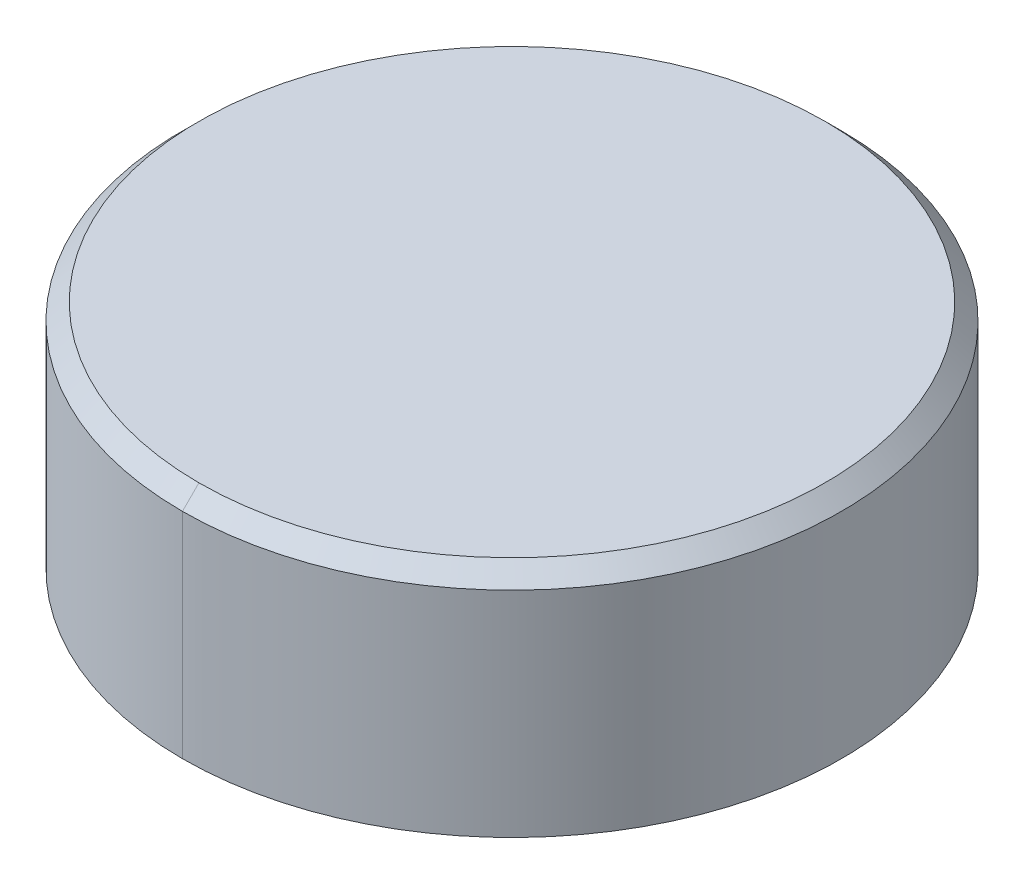
ISO-10303-21;
HEADER;
FILE_DESCRIPTION(('STEP AP214'),'2;1');
FILE_NAME('part.step','',(''),(''),'','','');
FILE_SCHEMA(('AUTOMOTIVE_DESIGN { 1 0 10303 214 1 1 1 1 }'));
ENDSEC;
DATA;
#1=APPLICATION_CONTEXT('core data for automotive mechanical design processes');
#2=APPLICATION_PROTOCOL_DEFINITION('international standard','automotive_design',2000,#1);
#3=PRODUCT_CONTEXT('',#1,'mechanical');
#4=PRODUCT('Part','Part','',(#3));
#5=PRODUCT_RELATED_PRODUCT_CATEGORY('part','',(#4));
#6=PRODUCT_DEFINITION_FORMATION('','',#4);
#7=PRODUCT_DEFINITION_CONTEXT('part definition',#1,'design');
#8=PRODUCT_DEFINITION('design','',#6,#7);
#9=PRODUCT_DEFINITION_SHAPE('','',#8);
#10=(LENGTH_UNIT() NAMED_UNIT(*) SI_UNIT(.MILLI.,.METRE.));
#11=(NAMED_UNIT(*) PLANE_ANGLE_UNIT() SI_UNIT($,.RADIAN.));
#12=(NAMED_UNIT(*) SI_UNIT($,.STERADIAN.) SOLID_ANGLE_UNIT());
#13=UNCERTAINTY_MEASURE_WITH_UNIT(LENGTH_MEASURE(1.E-05),#10,'distance_accuracy_value','');
#14=(GEOMETRIC_REPRESENTATION_CONTEXT(3) GLOBAL_UNCERTAINTY_ASSIGNED_CONTEXT((#13)) GLOBAL_UNIT_ASSIGNED_CONTEXT((#10,
#11,#12)) REPRESENTATION_CONTEXT('',''));
#15=CARTESIAN_POINT('',(0.,0.,0.));
#16=DIRECTION('',(0.,0.,1.));
#17=DIRECTION('',(1.,0.,0.));
#18=AXIS2_PLACEMENT_3D('',#15,#16,#17);
#19=CARTESIAN_POINT('',(0.,1.5,0.));
#20=DIRECTION('',(0.,-1.,0.));
#21=DIRECTION('',(0.,0.,-1.));
#22=AXIS2_PLACEMENT_3D('',#19,#20,#21);
#23=CONICAL_SURFACE('',#22,0.95,0.785398163397442);
#24=CARTESIAN_POINT('',(0.,1.5,0.));
#25=DIRECTION('',(0.,1.,0.));
#26=DIRECTION('',(0.,0.,1.));
#27=AXIS2_PLACEMENT_3D('',#24,#25,#26);
#28=CIRCLE('',#27,0.95);
#29=CARTESIAN_POINT('',(0.,1.5,0.95));
#30=VERTEX_POINT('',#29);
#31=CARTESIAN_POINT('',(0.,1.5,-0.95));
#32=VERTEX_POINT('',#31);
#33=EDGE_CURVE('E13',#30,#32,#28,.T.);
#34=ORIENTED_EDGE('',*,*,#33,.F.);
#35=DIRECTION('',(0.,-0.707106781186552,0.707106781186543));
#36=VECTOR('',#35,1.);
#37=CARTESIAN_POINT('',(0.,1.5,0.95));
#38=LINE('',#37,#36);
#39=CARTESIAN_POINT('',(0.,1.45,1.));
#40=VERTEX_POINT('',#39);
#41=EDGE_CURVE('E31',#30,#40,#38,.T.);
#42=ORIENTED_EDGE('',*,*,#41,.T.);
#43=CARTESIAN_POINT('',(0.,1.45,0.));
#44=DIRECTION('',(0.,-1.,0.));
#45=DIRECTION('',(0.,0.,1.));
#46=AXIS2_PLACEMENT_3D('',#43,#44,#45);
#47=CIRCLE('',#46,1.);
#48=CARTESIAN_POINT('',(0.,1.45,-1.));
#49=VERTEX_POINT('',#48);
#50=EDGE_CURVE('E82',#49,#40,#47,.T.);
#51=ORIENTED_EDGE('',*,*,#50,.F.);
#52=DIRECTION('',(0.,-0.707106781186552,-0.707106781186543));
#53=VECTOR('',#52,1.);
#54=CARTESIAN_POINT('',(0.,1.5,-0.95));
#55=LINE('',#54,#53);
#56=EDGE_CURVE('E79',#32,#49,#55,.T.);
#57=ORIENTED_EDGE('',*,*,#56,.F.);
#58=EDGE_LOOP('',(#34,#42,#51,#57));
#59=FACE_BOUND('',#58,.T.);
#60=ADVANCED_FACE('F24',(#59),#23,.T.);
#61=CARTESIAN_POINT('',(0.,1.5,0.));
#62=DIRECTION('',(0.,-1.,0.));
#63=DIRECTION('',(0.,0.,-1.));
#64=AXIS2_PLACEMENT_3D('',#61,#62,#63);
#65=CYLINDRICAL_SURFACE('',#64,1.);
#66=ORIENTED_EDGE('',*,*,#50,.T.);
#67=DIRECTION('',(0.,-1.,0.));
#68=VECTOR('',#67,1.);
#69=CARTESIAN_POINT('',(0.,1.5,1.));
#70=LINE('',#69,#68);
#71=CARTESIAN_POINT('',(0.,0.8,1.));
#72=VERTEX_POINT('',#71);
#73=EDGE_CURVE('E61',#40,#72,#70,.T.);
#74=ORIENTED_EDGE('',*,*,#73,.T.);
#75=CARTESIAN_POINT('',(0.,0.8,0.));
#76=DIRECTION('',(0.,1.,0.));
#77=DIRECTION('',(0.,0.,1.));
#78=AXIS2_PLACEMENT_3D('',#75,#76,#77);
#79=CIRCLE('',#78,1.);
#80=CARTESIAN_POINT('',(0.,0.8,-1.));
#81=VERTEX_POINT('',#80);
#82=EDGE_CURVE('E54',#72,#81,#79,.T.);
#83=ORIENTED_EDGE('',*,*,#82,.T.);
#84=DIRECTION('',(0.,-1.,0.));
#85=VECTOR('',#84,1.);
#86=CARTESIAN_POINT('',(0.,1.5,-1.));
#87=LINE('',#86,#85);
#88=EDGE_CURVE('E58',#49,#81,#87,.T.);
#89=ORIENTED_EDGE('',*,*,#88,.F.);
#90=EDGE_LOOP('',(#66,#74,#83,#89));
#91=FACE_BOUND('',#90,.T.);
#92=ADVANCED_FACE('F57',(#91),#65,.T.);
#93=CARTESIAN_POINT('',(0.,1.5,0.));
#94=DIRECTION('',(0.,-1.,0.));
#95=DIRECTION('',(0.,0.,-1.));
#96=AXIS2_PLACEMENT_3D('',#93,#94,#95);
#97=CYLINDRICAL_SURFACE('',#96,1.);
#98=ORIENTED_EDGE('',*,*,#73,.F.);
#99=CARTESIAN_POINT('',(0.,1.45,0.));
#100=DIRECTION('',(0.,-1.,0.));
#101=DIRECTION('',(0.,0.,1.));
#102=AXIS2_PLACEMENT_3D('',#99,#100,#101);
#103=CIRCLE('',#102,1.);
#104=EDGE_CURVE('E70',#40,#49,#103,.T.);
#105=ORIENTED_EDGE('',*,*,#104,.T.);
#106=ORIENTED_EDGE('',*,*,#88,.T.);
#107=CARTESIAN_POINT('',(0.,0.8,0.));
#108=DIRECTION('',(0.,1.,0.));
#109=DIRECTION('',(0.,0.,1.));
#110=AXIS2_PLACEMENT_3D('',#107,#108,#109);
#111=CIRCLE('',#110,1.);
#112=EDGE_CURVE('E68',#81,#72,#111,.T.);
#113=ORIENTED_EDGE('',*,*,#112,.T.);
#114=EDGE_LOOP('',(#98,#105,#106,#113));
#115=FACE_BOUND('',#114,.T.);
#116=ADVANCED_FACE('F67',(#115),#97,.T.);
#117=CARTESIAN_POINT('',(0.,1.5,0.));
#118=DIRECTION('',(0.,1.,0.));
#119=DIRECTION('',(1.,0.,0.));
#120=AXIS2_PLACEMENT_3D('',#117,#118,#119);
#121=PLANE('',#120);
#122=CARTESIAN_POINT('',(0.,1.5,0.));
#123=DIRECTION('',(0.,1.,0.));
#124=DIRECTION('',(0.,0.,1.));
#125=AXIS2_PLACEMENT_3D('',#122,#123,#124);
#126=CIRCLE('',#125,0.95);
#127=EDGE_CURVE('E73',#32,#30,#126,.T.);
#128=ORIENTED_EDGE('',*,*,#127,.T.);
#129=ORIENTED_EDGE('',*,*,#33,.T.);
#130=EDGE_LOOP('',(#128,#129));
#131=FACE_BOUND('',#130,.T.);
#132=ADVANCED_FACE('F86',(#131),#121,.T.);
#133=CARTESIAN_POINT('',(0.,0.8,0.));
#134=DIRECTION('',(0.,1.,0.));
#135=DIRECTION('',(1.,0.,0.));
#136=AXIS2_PLACEMENT_3D('',#133,#134,#135);
#137=PLANE('',#136);
#138=ORIENTED_EDGE('',*,*,#112,.F.);
#139=ORIENTED_EDGE('',*,*,#82,.F.);
#140=EDGE_LOOP('',(#138,#139));
#141=FACE_BOUND('',#140,.T.);
#142=ADVANCED_FACE('F72',(#141),#137,.F.);
#143=CARTESIAN_POINT('',(0.,1.5,0.));
#144=DIRECTION('',(0.,-1.,0.));
#145=DIRECTION('',(0.,0.,-1.));
#146=AXIS2_PLACEMENT_3D('',#143,#144,#145);
#147=CONICAL_SURFACE('',#146,0.95,0.785398163397442);
#148=ORIENTED_EDGE('',*,*,#41,.F.);
#149=ORIENTED_EDGE('',*,*,#127,.F.);
#150=ORIENTED_EDGE('',*,*,#56,.T.);
#151=ORIENTED_EDGE('',*,*,#104,.F.);
#152=EDGE_LOOP('',(#148,#149,#150,#151));
#153=FACE_BOUND('',#152,.T.);
#154=ADVANCED_FACE('F85',(#153),#147,.T.);
#155=CLOSED_SHELL('',(#60,#92,#116,#132,#142,#154));
#156=MANIFOLD_SOLID_BREP('B1',#155);
#157=ADVANCED_BREP_SHAPE_REPRESENTATION('',(#18,#156),#14);
#158=SHAPE_DEFINITION_REPRESENTATION(#9,#157);
ENDSEC;
END-ISO-10303-21;
